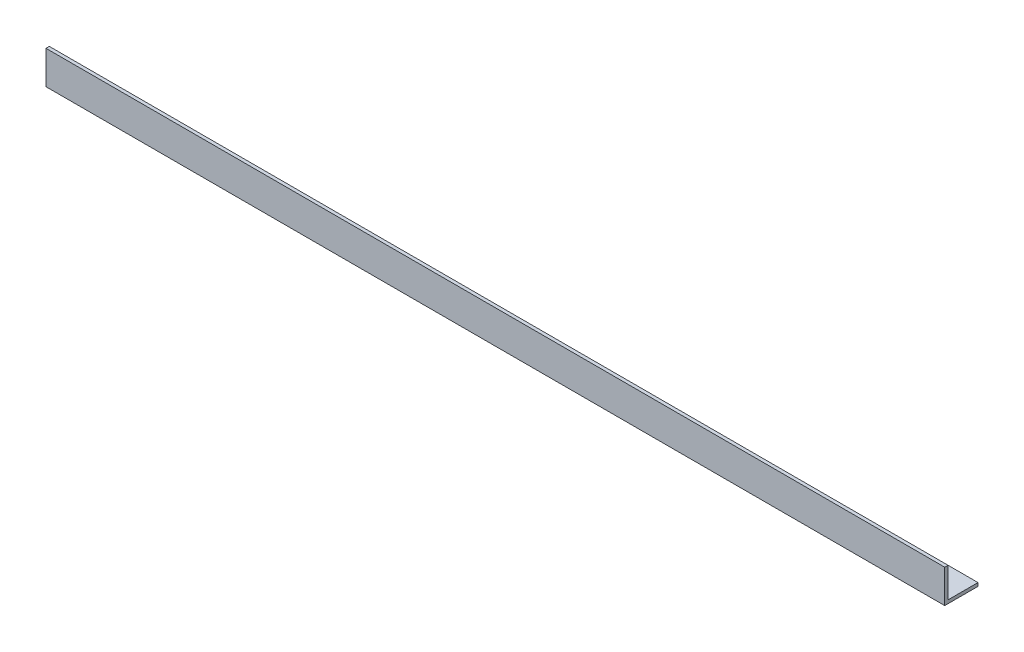
ISO-10303-21;
HEADER;
FILE_DESCRIPTION(('STEP AP214'),'2;1');
FILE_NAME('part.step','',(''),(''),'','','');
FILE_SCHEMA(('AUTOMOTIVE_DESIGN { 1 0 10303 214 1 1 1 1 }'));
ENDSEC;
DATA;
#1=APPLICATION_CONTEXT('core data for automotive mechanical design processes');
#2=APPLICATION_PROTOCOL_DEFINITION('international standard','automotive_design',2000,#1);
#3=PRODUCT_CONTEXT('',#1,'mechanical');
#4=PRODUCT('Part','Part','',(#3));
#5=PRODUCT_RELATED_PRODUCT_CATEGORY('part','',(#4));
#6=PRODUCT_DEFINITION_FORMATION('','',#4);
#7=PRODUCT_DEFINITION_CONTEXT('part definition',#1,'design');
#8=PRODUCT_DEFINITION('design','',#6,#7);
#9=PRODUCT_DEFINITION_SHAPE('','',#8);
#10=(LENGTH_UNIT() NAMED_UNIT(*) SI_UNIT(.MILLI.,.METRE.));
#11=(NAMED_UNIT(*) PLANE_ANGLE_UNIT() SI_UNIT($,.RADIAN.));
#12=(NAMED_UNIT(*) SI_UNIT($,.STERADIAN.) SOLID_ANGLE_UNIT());
#13=UNCERTAINTY_MEASURE_WITH_UNIT(LENGTH_MEASURE(1.E-05),#10,'distance_accuracy_value','');
#14=(GEOMETRIC_REPRESENTATION_CONTEXT(3) GLOBAL_UNCERTAINTY_ASSIGNED_CONTEXT((#13)) GLOBAL_UNIT_ASSIGNED_CONTEXT((#10,
#11,#12)) REPRESENTATION_CONTEXT('',''));
#15=CARTESIAN_POINT('',(0.,0.,0.));
#16=DIRECTION('',(0.,0.,1.));
#17=DIRECTION('',(1.,0.,0.));
#18=AXIS2_PLACEMENT_3D('',#15,#16,#17);
#19=CARTESIAN_POINT('',(270.,-4.,-5.));
#20=DIRECTION('',(0.,0.,1.));
#21=DIRECTION('',(0.,-1.,0.));
#22=AXIS2_PLACEMENT_3D('',#19,#20,#21);
#23=PLANE('',#22);
#24=DIRECTION('',(0.,1.,0.));
#25=VECTOR('',#24,1.);
#26=CARTESIAN_POINT('',(0.,-4.,-5.));
#27=LINE('',#26,#25);
#28=CARTESIAN_POINT('',(0.,-5.,-5.));
#29=VERTEX_POINT('',#28);
#30=CARTESIAN_POINT('',(0.,-4.,-5.));
#31=VERTEX_POINT('',#30);
#32=EDGE_CURVE('E119',#29,#31,#27,.T.);
#33=ORIENTED_EDGE('',*,*,#32,.T.);
#34=DIRECTION('',(-1.,0.,0.));
#35=VECTOR('',#34,1.);
#36=CARTESIAN_POINT('',(270.,-4.,-5.));
#37=LINE('',#36,#35);
#38=CARTESIAN_POINT('',(270.,-4.,-5.));
#39=VERTEX_POINT('',#38);
#40=EDGE_CURVE('E11',#39,#31,#37,.T.);
#41=ORIENTED_EDGE('',*,*,#40,.F.);
#42=DIRECTION('',(0.,1.,0.));
#43=VECTOR('',#42,1.);
#44=CARTESIAN_POINT('',(270.,-4.,-5.));
#45=LINE('',#44,#43);
#46=CARTESIAN_POINT('',(270.,-5.,-5.));
#47=VERTEX_POINT('',#46);
#48=EDGE_CURVE('E130',#47,#39,#45,.T.);
#49=ORIENTED_EDGE('',*,*,#48,.F.);
#50=DIRECTION('',(-1.,0.,0.));
#51=VECTOR('',#50,1.);
#52=CARTESIAN_POINT('',(270.,-5.,-5.));
#53=LINE('',#52,#51);
#54=EDGE_CURVE('E115',#47,#29,#53,.T.);
#55=ORIENTED_EDGE('',*,*,#54,.T.);
#56=EDGE_LOOP('',(#33,#41,#49,#55));
#57=FACE_BOUND('',#56,.T.);
#58=ADVANCED_FACE('F35',(#57),#23,.F.);
#59=CARTESIAN_POINT('',(270.,-4.,-5.));
#60=DIRECTION('',(0.,-1.,0.));
#61=DIRECTION('',(0.,0.,-1.));
#62=AXIS2_PLACEMENT_3D('',#59,#60,#61);
#63=PLANE('',#62);
#64=CARTESIAN_POINT('',(197.5,-4.,-0.500000000000012));
#65=DIRECTION('',(0.,1.,0.));
#66=DIRECTION('',(0.,0.,-1.));
#67=AXIS2_PLACEMENT_3D('',#64,#65,#66);
#68=CIRCLE('',#67,1.5);
#69=CARTESIAN_POINT('',(197.5,-4.,-2.00000000000001));
#70=VERTEX_POINT('',#69);
#71=EDGE_CURVE('E251',#70,#70,#68,.T.);
#72=ORIENTED_EDGE('',*,*,#71,.F.);
#73=EDGE_LOOP('',(#72));
#74=FACE_BOUND('',#73,.T.);
#75=CARTESIAN_POINT('',(10.,-4.,-0.500000000000005));
#76=DIRECTION('',(0.,1.,0.));
#77=DIRECTION('',(0.,0.,1.));
#78=AXIS2_PLACEMENT_3D('',#75,#76,#77);
#79=CIRCLE('',#78,1.5);
#80=CARTESIAN_POINT('',(10.,-4.,1.));
#81=VERTEX_POINT('',#80);
#82=EDGE_CURVE('E253',#81,#81,#79,.T.);
#83=ORIENTED_EDGE('',*,*,#82,.F.);
#84=EDGE_LOOP('',(#83));
#85=FACE_BOUND('',#84,.T.);
#86=CARTESIAN_POINT('',(72.5,-4.,-0.500000000000012));
#87=DIRECTION('',(0.,1.,0.));
#88=DIRECTION('',(0.,0.,1.));
#89=AXIS2_PLACEMENT_3D('',#86,#87,#88);
#90=CIRCLE('',#89,1.5);
#91=CARTESIAN_POINT('',(72.5,-4.,0.999999999999985));
#92=VERTEX_POINT('',#91);
#93=EDGE_CURVE('E261',#92,#92,#90,.T.);
#94=ORIENTED_EDGE('',*,*,#93,.F.);
#95=EDGE_LOOP('',(#94));
#96=FACE_BOUND('',#95,.T.);
#97=CARTESIAN_POINT('',(260.,-4.,-0.500000000000005));
#98=DIRECTION('',(0.,1.,0.));
#99=DIRECTION('',(0.,0.,-1.));
#100=AXIS2_PLACEMENT_3D('',#97,#98,#99);
#101=CIRCLE('',#100,1.49999999999997);
#102=CARTESIAN_POINT('',(260.,-4.,-1.99999999999998));
#103=VERTEX_POINT('',#102);
#104=EDGE_CURVE('E267',#103,#103,#101,.T.);
#105=ORIENTED_EDGE('',*,*,#104,.F.);
#106=EDGE_LOOP('',(#105));
#107=FACE_BOUND('',#106,.T.);
#108=CARTESIAN_POINT('',(135.,-4.,-0.500000000000003));
#109=DIRECTION('',(0.,1.,0.));
#110=DIRECTION('',(0.,0.,1.));
#111=AXIS2_PLACEMENT_3D('',#108,#109,#110);
#112=CIRCLE('',#111,1.5);
#113=CARTESIAN_POINT('',(135.,-4.,0.999999999999994));
#114=VERTEX_POINT('',#113);
#115=EDGE_CURVE('E273',#114,#114,#112,.T.);
#116=ORIENTED_EDGE('',*,*,#115,.F.);
#117=EDGE_LOOP('',(#116));
#118=FACE_BOUND('',#117,.T.);
#119=DIRECTION('',(0.,0.,1.));
#120=VECTOR('',#119,1.);
#121=CARTESIAN_POINT('',(0.,-4.,-5.));
#122=LINE('',#121,#120);
#123=CARTESIAN_POINT('',(0.,-4.,4.));
#124=VERTEX_POINT('',#123);
#125=EDGE_CURVE('E122',#31,#124,#122,.T.);
#126=ORIENTED_EDGE('',*,*,#125,.T.);
#127=DIRECTION('',(-1.,0.,0.));
#128=VECTOR('',#127,1.);
#129=CARTESIAN_POINT('',(270.,-4.,4.));
#130=LINE('',#129,#128);
#131=CARTESIAN_POINT('',(270.,-4.,4.));
#132=VERTEX_POINT('',#131);
#133=EDGE_CURVE('E43',#132,#124,#130,.T.);
#134=ORIENTED_EDGE('',*,*,#133,.F.);
#135=DIRECTION('',(0.,0.,1.));
#136=VECTOR('',#135,1.);
#137=CARTESIAN_POINT('',(270.,-4.,-5.));
#138=LINE('',#137,#136);
#139=EDGE_CURVE('E88',#39,#132,#138,.T.);
#140=ORIENTED_EDGE('',*,*,#139,.F.);
#141=ORIENTED_EDGE('',*,*,#40,.T.);
#142=EDGE_LOOP('',(#126,#134,#140,#141));
#143=FACE_BOUND('',#142,.T.);
#144=ADVANCED_FACE('F159',(#74,#85,#96,#107,#118,#143),#63,.F.);
#145=CARTESIAN_POINT('',(270.,5.,4.));
#146=DIRECTION('',(0.,0.,1.));
#147=DIRECTION('',(0.,-1.,0.));
#148=AXIS2_PLACEMENT_3D('',#145,#146,#147);
#149=PLANE('',#148);
#150=DIRECTION('',(0.,1.,0.));
#151=VECTOR('',#150,1.);
#152=CARTESIAN_POINT('',(0.,5.,4.));
#153=LINE('',#152,#151);
#154=CARTESIAN_POINT('',(0.,5.,4.));
#155=VERTEX_POINT('',#154);
#156=EDGE_CURVE('E125',#124,#155,#153,.T.);
#157=ORIENTED_EDGE('',*,*,#156,.T.);
#158=DIRECTION('',(-1.,0.,0.));
#159=VECTOR('',#158,1.);
#160=CARTESIAN_POINT('',(270.,5.,4.));
#161=LINE('',#160,#159);
#162=CARTESIAN_POINT('',(270.,5.,4.));
#163=VERTEX_POINT('',#162);
#164=EDGE_CURVE('E110',#163,#155,#161,.T.);
#165=ORIENTED_EDGE('',*,*,#164,.F.);
#166=DIRECTION('',(0.,1.,0.));
#167=VECTOR('',#166,1.);
#168=CARTESIAN_POINT('',(270.,5.,4.));
#169=LINE('',#168,#167);
#170=EDGE_CURVE('E101',#132,#163,#169,.T.);
#171=ORIENTED_EDGE('',*,*,#170,.F.);
#172=ORIENTED_EDGE('',*,*,#133,.T.);
#173=EDGE_LOOP('',(#157,#165,#171,#172));
#174=FACE_BOUND('',#173,.T.);
#175=ADVANCED_FACE('F136',(#174),#149,.F.);
#176=CARTESIAN_POINT('',(270.,5.,5.));
#177=DIRECTION('',(0.,-1.,0.));
#178=DIRECTION('',(0.,0.,-1.));
#179=AXIS2_PLACEMENT_3D('',#176,#177,#178);
#180=PLANE('',#179);
#181=DIRECTION('',(0.,0.,1.));
#182=VECTOR('',#181,1.);
#183=CARTESIAN_POINT('',(0.,5.,5.));
#184=LINE('',#183,#182);
#185=CARTESIAN_POINT('',(0.,5.,5.));
#186=VERTEX_POINT('',#185);
#187=EDGE_CURVE('E109',#155,#186,#184,.T.);
#188=ORIENTED_EDGE('',*,*,#187,.T.);
#189=DIRECTION('',(-1.,0.,0.));
#190=VECTOR('',#189,1.);
#191=CARTESIAN_POINT('',(270.,5.,5.));
#192=LINE('',#191,#190);
#193=CARTESIAN_POINT('',(270.,5.,5.));
#194=VERTEX_POINT('',#193);
#195=EDGE_CURVE('E106',#194,#186,#192,.T.);
#196=ORIENTED_EDGE('',*,*,#195,.F.);
#197=DIRECTION('',(0.,0.,1.));
#198=VECTOR('',#197,1.);
#199=CARTESIAN_POINT('',(270.,5.,5.));
#200=LINE('',#199,#198);
#201=EDGE_CURVE('E95',#163,#194,#200,.T.);
#202=ORIENTED_EDGE('',*,*,#201,.F.);
#203=ORIENTED_EDGE('',*,*,#164,.T.);
#204=EDGE_LOOP('',(#188,#196,#202,#203));
#205=FACE_BOUND('',#204,.T.);
#206=ADVANCED_FACE('F107',(#205),#180,.F.);
#207=CARTESIAN_POINT('',(270.,5.,5.));
#208=DIRECTION('',(0.,0.,-1.));
#209=DIRECTION('',(0.,1.,0.));
#210=AXIS2_PLACEMENT_3D('',#207,#208,#209);
#211=PLANE('',#210);
#212=DIRECTION('',(0.,-1.,0.));
#213=VECTOR('',#212,1.);
#214=CARTESIAN_POINT('',(0.,5.,5.));
#215=LINE('',#214,#213);
#216=CARTESIAN_POINT('',(0.,-5.,5.));
#217=VERTEX_POINT('',#216);
#218=EDGE_CURVE('E74',#186,#217,#215,.T.);
#219=ORIENTED_EDGE('',*,*,#218,.T.);
#220=DIRECTION('',(-1.,0.,0.));
#221=VECTOR('',#220,1.);
#222=CARTESIAN_POINT('',(270.,-5.,5.));
#223=LINE('',#222,#221);
#224=CARTESIAN_POINT('',(270.,-5.,5.));
#225=VERTEX_POINT('',#224);
#226=EDGE_CURVE('E111',#225,#217,#223,.T.);
#227=ORIENTED_EDGE('',*,*,#226,.F.);
#228=DIRECTION('',(0.,-1.,0.));
#229=VECTOR('',#228,1.);
#230=CARTESIAN_POINT('',(270.,5.,5.));
#231=LINE('',#230,#229);
#232=EDGE_CURVE('E99',#194,#225,#231,.T.);
#233=ORIENTED_EDGE('',*,*,#232,.F.);
#234=ORIENTED_EDGE('',*,*,#195,.T.);
#235=EDGE_LOOP('',(#219,#227,#233,#234));
#236=FACE_BOUND('',#235,.T.);
#237=ADVANCED_FACE('F113',(#236),#211,.F.);
#238=CARTESIAN_POINT('',(270.,-5.,5.));
#239=DIRECTION('',(0.,1.,0.));
#240=DIRECTION('',(0.,0.,1.));
#241=AXIS2_PLACEMENT_3D('',#238,#239,#240);
#242=PLANE('',#241);
#243=CARTESIAN_POINT('',(197.5,-5.,-0.500000000000012));
#244=DIRECTION('',(0.,1.,0.));
#245=DIRECTION('',(0.,0.,1.));
#246=AXIS2_PLACEMENT_3D('',#243,#244,#245);
#247=CIRCLE('',#246,1.5);
#248=CARTESIAN_POINT('',(197.5,-5.,0.999999999999985));
#249=VERTEX_POINT('',#248);
#250=EDGE_CURVE('E249',#249,#249,#247,.F.);
#251=ORIENTED_EDGE('',*,*,#250,.F.);
#252=EDGE_LOOP('',(#251));
#253=FACE_BOUND('',#252,.T.);
#254=CARTESIAN_POINT('',(10.,-5.,-0.500000000000005));
#255=DIRECTION('',(0.,1.,0.));
#256=DIRECTION('',(0.,0.,1.));
#257=AXIS2_PLACEMENT_3D('',#254,#255,#256);
#258=CIRCLE('',#257,1.5);
#259=CARTESIAN_POINT('',(10.,-5.,0.999999999999999));
#260=VERTEX_POINT('',#259);
#261=EDGE_CURVE('E258',#260,#260,#258,.F.);
#262=ORIENTED_EDGE('',*,*,#261,.F.);
#263=EDGE_LOOP('',(#262));
#264=FACE_BOUND('',#263,.T.);
#265=CARTESIAN_POINT('',(72.5,-5.,-0.500000000000012));
#266=DIRECTION('',(0.,1.,0.));
#267=DIRECTION('',(0.,0.,1.));
#268=AXIS2_PLACEMENT_3D('',#265,#266,#267);
#269=CIRCLE('',#268,1.5);
#270=CARTESIAN_POINT('',(72.5,-5.,0.999999999999985));
#271=VERTEX_POINT('',#270);
#272=EDGE_CURVE('E264',#271,#271,#269,.F.);
#273=ORIENTED_EDGE('',*,*,#272,.F.);
#274=EDGE_LOOP('',(#273));
#275=FACE_BOUND('',#274,.T.);
#276=CARTESIAN_POINT('',(260.,-5.,-0.500000000000005));
#277=DIRECTION('',(0.,1.,0.));
#278=DIRECTION('',(0.,0.,1.));
#279=AXIS2_PLACEMENT_3D('',#276,#277,#278);
#280=CIRCLE('',#279,1.49999999999997);
#281=CARTESIAN_POINT('',(260.,-5.,0.999999999999966));
#282=VERTEX_POINT('',#281);
#283=EDGE_CURVE('E270',#282,#282,#280,.F.);
#284=ORIENTED_EDGE('',*,*,#283,.F.);
#285=EDGE_LOOP('',(#284));
#286=FACE_BOUND('',#285,.T.);
#287=CARTESIAN_POINT('',(135.,-5.,-0.500000000000004));
#288=DIRECTION('',(0.,1.,0.));
#289=DIRECTION('',(0.,0.,1.));
#290=AXIS2_PLACEMENT_3D('',#287,#288,#289);
#291=CIRCLE('',#290,1.5);
#292=CARTESIAN_POINT('',(135.,-5.,0.999999999999994));
#293=VERTEX_POINT('',#292);
#294=EDGE_CURVE('E123',#293,#293,#291,.F.);
#295=ORIENTED_EDGE('',*,*,#294,.F.);
#296=EDGE_LOOP('',(#295));
#297=FACE_BOUND('',#296,.T.);
#298=DIRECTION('',(0.,0.,-1.));
#299=VECTOR('',#298,1.);
#300=CARTESIAN_POINT('',(0.,-5.,5.));
#301=LINE('',#300,#299);
#302=EDGE_CURVE('E80',#217,#29,#301,.T.);
#303=ORIENTED_EDGE('',*,*,#302,.T.);
#304=ORIENTED_EDGE('',*,*,#54,.F.);
#305=DIRECTION('',(0.,0.,-1.));
#306=VECTOR('',#305,1.);
#307=CARTESIAN_POINT('',(270.,-5.,5.));
#308=LINE('',#307,#306);
#309=EDGE_CURVE('E51',#225,#47,#308,.T.);
#310=ORIENTED_EDGE('',*,*,#309,.F.);
#311=ORIENTED_EDGE('',*,*,#226,.T.);
#312=EDGE_LOOP('',(#303,#304,#310,#311));
#313=FACE_BOUND('',#312,.T.);
#314=ADVANCED_FACE('F143',(#253,#264,#275,#286,#297,#313),#242,.F.);
#315=CARTESIAN_POINT('',(270.,0.,0.));
#316=DIRECTION('',(1.,0.,0.));
#317=DIRECTION('',(0.,0.,-1.));
#318=AXIS2_PLACEMENT_3D('',#315,#316,#317);
#319=PLANE('',#318);
#320=ORIENTED_EDGE('',*,*,#48,.T.);
#321=ORIENTED_EDGE('',*,*,#139,.T.);
#322=ORIENTED_EDGE('',*,*,#170,.T.);
#323=ORIENTED_EDGE('',*,*,#201,.T.);
#324=ORIENTED_EDGE('',*,*,#232,.T.);
#325=ORIENTED_EDGE('',*,*,#309,.T.);
#326=EDGE_LOOP('',(#320,#321,#322,#323,#324,#325));
#327=FACE_BOUND('',#326,.T.);
#328=ADVANCED_FACE('F97',(#327),#319,.T.);
#329=CARTESIAN_POINT('',(0.,0.,0.));
#330=DIRECTION('',(1.,0.,0.));
#331=DIRECTION('',(0.,0.,-1.));
#332=AXIS2_PLACEMENT_3D('',#329,#330,#331);
#333=PLANE('',#332);
#334=ORIENTED_EDGE('',*,*,#32,.F.);
#335=ORIENTED_EDGE('',*,*,#302,.F.);
#336=ORIENTED_EDGE('',*,*,#218,.F.);
#337=ORIENTED_EDGE('',*,*,#187,.F.);
#338=ORIENTED_EDGE('',*,*,#156,.F.);
#339=ORIENTED_EDGE('',*,*,#125,.F.);
#340=EDGE_LOOP('',(#334,#335,#336,#337,#338,#339));
#341=FACE_BOUND('',#340,.T.);
#342=ADVANCED_FACE('F139',(#341),#333,.F.);
#343=CARTESIAN_POINT('',(135.,-9.2426406871193,-0.500000000000004));
#344=DIRECTION('',(0.,1.,0.));
#345=DIRECTION('',(0.,0.,1.));
#346=AXIS2_PLACEMENT_3D('',#343,#344,#345);
#347=CYLINDRICAL_SURFACE('',#346,1.5);
#348=ORIENTED_EDGE('',*,*,#294,.T.);
#349=EDGE_LOOP('',(#348));
#350=FACE_BOUND('',#349,.T.);
#351=ORIENTED_EDGE('',*,*,#115,.T.);
#352=EDGE_LOOP('',(#351));
#353=FACE_BOUND('',#352,.T.);
#354=ADVANCED_FACE('F193',(#350,#353),#347,.F.);
#355=CARTESIAN_POINT('',(260.,-9.2426406871193,-0.500000000000005));
#356=DIRECTION('',(0.,1.,0.));
#357=DIRECTION('',(0.,0.,1.));
#358=AXIS2_PLACEMENT_3D('',#355,#356,#357);
#359=CYLINDRICAL_SURFACE('',#358,1.49999999999997);
#360=ORIENTED_EDGE('',*,*,#283,.T.);
#361=EDGE_LOOP('',(#360));
#362=FACE_BOUND('',#361,.T.);
#363=ORIENTED_EDGE('',*,*,#104,.T.);
#364=EDGE_LOOP('',(#363));
#365=FACE_BOUND('',#364,.T.);
#366=ADVANCED_FACE('F198',(#362,#365),#359,.F.);
#367=CARTESIAN_POINT('',(72.5,-9.2426406871193,-0.500000000000013));
#368=DIRECTION('',(0.,1.,0.));
#369=DIRECTION('',(0.,0.,1.));
#370=AXIS2_PLACEMENT_3D('',#367,#368,#369);
#371=CYLINDRICAL_SURFACE('',#370,1.5);
#372=ORIENTED_EDGE('',*,*,#272,.T.);
#373=EDGE_LOOP('',(#372));
#374=FACE_BOUND('',#373,.T.);
#375=ORIENTED_EDGE('',*,*,#93,.T.);
#376=EDGE_LOOP('',(#375));
#377=FACE_BOUND('',#376,.T.);
#378=ADVANCED_FACE('F206',(#374,#377),#371,.F.);
#379=CARTESIAN_POINT('',(10.,-9.2426406871193,-0.500000000000005));
#380=DIRECTION('',(0.,1.,0.));
#381=DIRECTION('',(0.,0.,1.));
#382=AXIS2_PLACEMENT_3D('',#379,#380,#381);
#383=CYLINDRICAL_SURFACE('',#382,1.5);
#384=ORIENTED_EDGE('',*,*,#261,.T.);
#385=EDGE_LOOP('',(#384));
#386=FACE_BOUND('',#385,.T.);
#387=ORIENTED_EDGE('',*,*,#82,.T.);
#388=EDGE_LOOP('',(#387));
#389=FACE_BOUND('',#388,.T.);
#390=ADVANCED_FACE('F214',(#386,#389),#383,.F.);
#391=CARTESIAN_POINT('',(197.5,-9.2426406871193,-0.500000000000013));
#392=DIRECTION('',(0.,1.,0.));
#393=DIRECTION('',(0.,0.,1.));
#394=AXIS2_PLACEMENT_3D('',#391,#392,#393);
#395=CYLINDRICAL_SURFACE('',#394,1.5);
#396=ORIENTED_EDGE('',*,*,#250,.T.);
#397=EDGE_LOOP('',(#396));
#398=FACE_BOUND('',#397,.T.);
#399=ORIENTED_EDGE('',*,*,#71,.T.);
#400=EDGE_LOOP('',(#399));
#401=FACE_BOUND('',#400,.T.);
#402=ADVANCED_FACE('F222',(#398,#401),#395,.F.);
#403=CLOSED_SHELL('',(#58,#144,#175,#206,#237,#314,#328,#342,#354,#366,#378,#390,#402));
#404=MANIFOLD_SOLID_BREP('B2',#403);
#405=ADVANCED_BREP_SHAPE_REPRESENTATION('',(#18,#404),#14);
#406=SHAPE_DEFINITION_REPRESENTATION(#9,#405);
ENDSEC;
END-ISO-10303-21;
